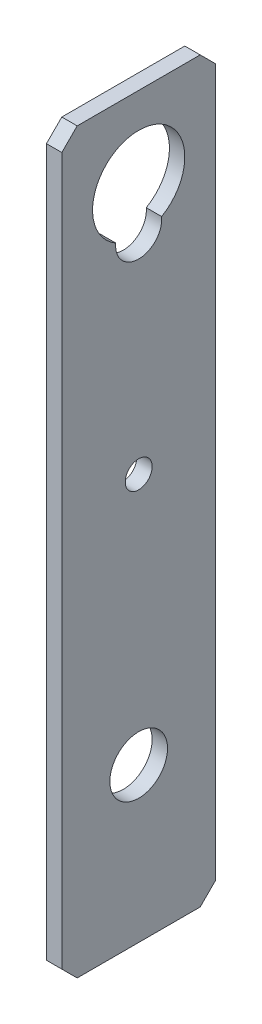
ISO-10303-21;
HEADER;
FILE_DESCRIPTION(('STEP AP214'),'2;1');
FILE_NAME('part.step','',(''),(''),'','','');
FILE_SCHEMA(('AUTOMOTIVE_DESIGN { 1 0 10303 214 1 1 1 1 }'));
ENDSEC;
DATA;
#1=APPLICATION_CONTEXT('core data for automotive mechanical design processes');
#2=APPLICATION_PROTOCOL_DEFINITION('international standard','automotive_design',2000,#1);
#3=PRODUCT_CONTEXT('',#1,'mechanical');
#4=PRODUCT('Part','Part','',(#3));
#5=PRODUCT_RELATED_PRODUCT_CATEGORY('part','',(#4));
#6=PRODUCT_DEFINITION_FORMATION('','',#4);
#7=PRODUCT_DEFINITION_CONTEXT('part definition',#1,'design');
#8=PRODUCT_DEFINITION('design','',#6,#7);
#9=PRODUCT_DEFINITION_SHAPE('','',#8);
#10=(LENGTH_UNIT() NAMED_UNIT(*) SI_UNIT(.MILLI.,.METRE.));
#11=(NAMED_UNIT(*) PLANE_ANGLE_UNIT() SI_UNIT($,.RADIAN.));
#12=(NAMED_UNIT(*) SI_UNIT($,.STERADIAN.) SOLID_ANGLE_UNIT());
#13=UNCERTAINTY_MEASURE_WITH_UNIT(LENGTH_MEASURE(1.E-05),#10,'distance_accuracy_value','');
#14=(GEOMETRIC_REPRESENTATION_CONTEXT(3) GLOBAL_UNCERTAINTY_ASSIGNED_CONTEXT((#13)) GLOBAL_UNIT_ASSIGNED_CONTEXT((#10,
#11,#12)) REPRESENTATION_CONTEXT('',''));
#15=CARTESIAN_POINT('',(0.,0.,0.));
#16=DIRECTION('',(0.,0.,1.));
#17=DIRECTION('',(1.,0.,0.));
#18=AXIS2_PLACEMENT_3D('',#15,#16,#17);
#19=CARTESIAN_POINT('',(2.,-48.,-10.));
#20=DIRECTION('',(0.,0.,1.));
#21=DIRECTION('',(1.,0.,0.));
#22=AXIS2_PLACEMENT_3D('',#19,#20,#21);
#23=PLANE('',#22);
#24=DIRECTION('',(0.,1.,0.));
#25=VECTOR('',#24,1.);
#26=CARTESIAN_POINT('',(2.,-48.,-10.));
#27=LINE('',#26,#25);
#28=CARTESIAN_POINT('',(2.,-46.,-10.));
#29=VERTEX_POINT('',#28);
#30=CARTESIAN_POINT('',(2.,46.,-10.));
#31=VERTEX_POINT('',#30);
#32=EDGE_CURVE('E155',#29,#31,#27,.T.);
#33=ORIENTED_EDGE('',*,*,#32,.F.);
#34=DIRECTION('',(-1.,0.,0.));
#35=VECTOR('',#34,1.);
#36=CARTESIAN_POINT('',(2.,-46.,-10.));
#37=LINE('',#36,#35);
#38=CARTESIAN_POINT('',(0.,-46.,-10.));
#39=VERTEX_POINT('',#38);
#40=EDGE_CURVE('E202',#29,#39,#37,.T.);
#41=ORIENTED_EDGE('',*,*,#40,.T.);
#42=DIRECTION('',(0.,1.,0.));
#43=VECTOR('',#42,1.);
#44=CARTESIAN_POINT('',(0.,-48.,-10.));
#45=LINE('',#44,#43);
#46=CARTESIAN_POINT('',(0.,46.,-10.));
#47=VERTEX_POINT('',#46);
#48=EDGE_CURVE('E151',#39,#47,#45,.T.);
#49=ORIENTED_EDGE('',*,*,#48,.T.);
#50=DIRECTION('',(1.,0.,0.));
#51=VECTOR('',#50,1.);
#52=CARTESIAN_POINT('',(2.,46.,-10.));
#53=LINE('',#52,#51);
#54=EDGE_CURVE('E200',#47,#31,#53,.T.);
#55=ORIENTED_EDGE('',*,*,#54,.T.);
#56=EDGE_LOOP('',(#33,#41,#49,#55));
#57=FACE_BOUND('',#56,.T.);
#58=ADVANCED_FACE('F41',(#57),#23,.F.);
#59=CARTESIAN_POINT('',(2.,48.,10.));
#60=DIRECTION('',(0.,-1.,0.));
#61=DIRECTION('',(0.,0.,-1.));
#62=AXIS2_PLACEMENT_3D('',#59,#60,#61);
#63=PLANE('',#62);
#64=DIRECTION('',(0.,0.,1.));
#65=VECTOR('',#64,1.);
#66=CARTESIAN_POINT('',(2.,48.,10.));
#67=LINE('',#66,#65);
#68=CARTESIAN_POINT('',(2.,48.,-8.));
#69=VERTEX_POINT('',#68);
#70=CARTESIAN_POINT('',(2.,48.,7.99999999999999));
#71=VERTEX_POINT('',#70);
#72=EDGE_CURVE('E157',#69,#71,#67,.T.);
#73=ORIENTED_EDGE('',*,*,#72,.F.);
#74=DIRECTION('',(-1.,0.,0.));
#75=VECTOR('',#74,1.);
#76=CARTESIAN_POINT('',(2.,48.,-8.));
#77=LINE('',#76,#75);
#78=CARTESIAN_POINT('',(0.,48.,-8.));
#79=VERTEX_POINT('',#78);
#80=EDGE_CURVE('E11',#69,#79,#77,.T.);
#81=ORIENTED_EDGE('',*,*,#80,.T.);
#82=DIRECTION('',(0.,0.,1.));
#83=VECTOR('',#82,1.);
#84=CARTESIAN_POINT('',(0.,48.,10.));
#85=LINE('',#84,#83);
#86=CARTESIAN_POINT('',(0.,48.,7.99999999999999));
#87=VERTEX_POINT('',#86);
#88=EDGE_CURVE('E169',#79,#87,#85,.T.);
#89=ORIENTED_EDGE('',*,*,#88,.T.);
#90=DIRECTION('',(1.,0.,0.));
#91=VECTOR('',#90,1.);
#92=CARTESIAN_POINT('',(2.,48.,7.99999999999999));
#93=LINE('',#92,#91);
#94=EDGE_CURVE('E50',#87,#71,#93,.T.);
#95=ORIENTED_EDGE('',*,*,#94,.T.);
#96=EDGE_LOOP('',(#73,#81,#89,#95));
#97=FACE_BOUND('',#96,.T.);
#98=ADVANCED_FACE('F218',(#97),#63,.F.);
#99=CARTESIAN_POINT('',(2.,-48.,10.));
#100=DIRECTION('',(0.,0.,-1.));
#101=DIRECTION('',(-1.,0.,0.));
#102=AXIS2_PLACEMENT_3D('',#99,#100,#101);
#103=PLANE('',#102);
#104=DIRECTION('',(0.,-1.,0.));
#105=VECTOR('',#104,1.);
#106=CARTESIAN_POINT('',(0.,-48.,10.));
#107=LINE('',#106,#105);
#108=CARTESIAN_POINT('',(0.,46.,10.));
#109=VERTEX_POINT('',#108);
#110=CARTESIAN_POINT('',(0.,-46.,10.));
#111=VERTEX_POINT('',#110);
#112=EDGE_CURVE('E171',#109,#111,#107,.T.);
#113=ORIENTED_EDGE('',*,*,#112,.T.);
#114=DIRECTION('',(1.,0.,0.));
#115=VECTOR('',#114,1.);
#116=CARTESIAN_POINT('',(2.,-46.,10.));
#117=LINE('',#116,#115);
#118=CARTESIAN_POINT('',(2.,-46.,10.));
#119=VERTEX_POINT('',#118);
#120=EDGE_CURVE('E191',#111,#119,#117,.T.);
#121=ORIENTED_EDGE('',*,*,#120,.T.);
#122=DIRECTION('',(0.,-1.,0.));
#123=VECTOR('',#122,1.);
#124=CARTESIAN_POINT('',(2.,-48.,10.));
#125=LINE('',#124,#123);
#126=CARTESIAN_POINT('',(2.,46.,10.));
#127=VERTEX_POINT('',#126);
#128=EDGE_CURVE('E160',#127,#119,#125,.T.);
#129=ORIENTED_EDGE('',*,*,#128,.F.);
#130=DIRECTION('',(-1.,0.,0.));
#131=VECTOR('',#130,1.);
#132=CARTESIAN_POINT('',(2.,46.,10.));
#133=LINE('',#132,#131);
#134=EDGE_CURVE('E188',#127,#109,#133,.T.);
#135=ORIENTED_EDGE('',*,*,#134,.T.);
#136=EDGE_LOOP('',(#113,#121,#129,#135));
#137=FACE_BOUND('',#136,.T.);
#138=ADVANCED_FACE('F225',(#137),#103,.F.);
#139=CARTESIAN_POINT('',(2.,-48.,10.));
#140=DIRECTION('',(0.,1.,0.));
#141=DIRECTION('',(0.,0.,1.));
#142=AXIS2_PLACEMENT_3D('',#139,#140,#141);
#143=PLANE('',#142);
#144=DIRECTION('',(0.,0.,-1.));
#145=VECTOR('',#144,1.);
#146=CARTESIAN_POINT('',(2.,-48.,10.));
#147=LINE('',#146,#145);
#148=CARTESIAN_POINT('',(2.,-48.,8.));
#149=VERTEX_POINT('',#148);
#150=CARTESIAN_POINT('',(2.,-48.,-7.99999999999998));
#151=VERTEX_POINT('',#150);
#152=EDGE_CURVE('E163',#149,#151,#147,.T.);
#153=ORIENTED_EDGE('',*,*,#152,.F.);
#154=DIRECTION('',(-1.,0.,0.));
#155=VECTOR('',#154,1.);
#156=CARTESIAN_POINT('',(2.,-48.,8.));
#157=LINE('',#156,#155);
#158=CARTESIAN_POINT('',(0.,-48.,8.));
#159=VERTEX_POINT('',#158);
#160=EDGE_CURVE('E177',#149,#159,#157,.T.);
#161=ORIENTED_EDGE('',*,*,#160,.T.);
#162=DIRECTION('',(0.,0.,-1.));
#163=VECTOR('',#162,1.);
#164=CARTESIAN_POINT('',(0.,-48.,10.));
#165=LINE('',#164,#163);
#166=CARTESIAN_POINT('',(0.,-48.,-7.99999999999998));
#167=VERTEX_POINT('',#166);
#168=EDGE_CURVE('E158',#159,#167,#165,.T.);
#169=ORIENTED_EDGE('',*,*,#168,.T.);
#170=DIRECTION('',(1.,0.,0.));
#171=VECTOR('',#170,1.);
#172=CARTESIAN_POINT('',(2.,-48.,-7.99999999999998));
#173=LINE('',#172,#171);
#174=EDGE_CURVE('E166',#167,#151,#173,.T.);
#175=ORIENTED_EDGE('',*,*,#174,.T.);
#176=EDGE_LOOP('',(#153,#161,#169,#175));
#177=FACE_BOUND('',#176,.T.);
#178=ADVANCED_FACE('F233',(#177),#143,.F.);
#179=CARTESIAN_POINT('',(2.,0.,0.));
#180=DIRECTION('',(-1.,0.,0.));
#181=DIRECTION('',(0.,0.,1.));
#182=AXIS2_PLACEMENT_3D('',#179,#180,#181);
#183=PLANE('',#182);
#184=CARTESIAN_POINT('',(2.,37.5,0.));
#185=DIRECTION('',(1.,0.,0.));
#186=DIRECTION('',(0.,0.,-1.));
#187=AXIS2_PLACEMENT_3D('',#184,#185,#186);
#188=CIRCLE('',#187,6.);
#189=CARTESIAN_POINT('',(2.,32.2954545454545,-2.98541565139099));
#190=VERTEX_POINT('',#189);
#191=CARTESIAN_POINT('',(2.,32.2954545454545,2.98541565139099));
#192=VERTEX_POINT('',#191);
#193=EDGE_CURVE('E133',#190,#192,#188,.T.);
#194=ORIENTED_EDGE('',*,*,#193,.F.);
#195=CARTESIAN_POINT('',(2.,32.,0.));
#196=DIRECTION('',(1.,0.,0.));
#197=DIRECTION('',(0.,0.,-1.));
#198=AXIS2_PLACEMENT_3D('',#195,#196,#197);
#199=CIRCLE('',#198,3.);
#200=EDGE_CURVE('E123',#192,#190,#199,.T.);
#201=ORIENTED_EDGE('',*,*,#200,.F.);
#202=EDGE_LOOP('',(#194,#201));
#203=FACE_BOUND('',#202,.T.);
#204=CARTESIAN_POINT('',(2.,-28.,0.));
#205=DIRECTION('',(1.,0.,0.));
#206=DIRECTION('',(0.,0.,-1.));
#207=AXIS2_PLACEMENT_3D('',#204,#205,#206);
#208=CIRCLE('',#207,3.75);
#209=CARTESIAN_POINT('',(2.,-28.,-3.75));
#210=VERTEX_POINT('',#209);
#211=EDGE_CURVE('E142',#210,#210,#208,.T.);
#212=ORIENTED_EDGE('',*,*,#211,.F.);
#213=EDGE_LOOP('',(#212));
#214=FACE_BOUND('',#213,.T.);
#215=CARTESIAN_POINT('',(2.,4.74999999999999,0.));
#216=DIRECTION('',(1.,0.,0.));
#217=DIRECTION('',(0.,0.,-1.));
#218=AXIS2_PLACEMENT_3D('',#215,#216,#217);
#219=CIRCLE('',#218,1.75);
#220=CARTESIAN_POINT('',(2.,4.74999999999999,-1.75));
#221=VERTEX_POINT('',#220);
#222=EDGE_CURVE('E152',#221,#221,#219,.T.);
#223=ORIENTED_EDGE('',*,*,#222,.F.);
#224=EDGE_LOOP('',(#223));
#225=FACE_BOUND('',#224,.T.);
#226=ORIENTED_EDGE('',*,*,#128,.T.);
#227=DIRECTION('',(0.,0.70710678118655,0.707106781186545));
#228=VECTOR('',#227,1.);
#229=CARTESIAN_POINT('',(2.,-48.,8.));
#230=LINE('',#229,#228);
#231=EDGE_CURVE('E198',#119,#149,#230,.F.);
#232=ORIENTED_EDGE('',*,*,#231,.T.);
#233=ORIENTED_EDGE('',*,*,#152,.T.);
#234=DIRECTION('',(0.,-0.707106781186545,0.70710678118655));
#235=VECTOR('',#234,1.);
#236=CARTESIAN_POINT('',(2.,-46.,-10.));
#237=LINE('',#236,#235);
#238=EDGE_CURVE('E196',#151,#29,#237,.F.);
#239=ORIENTED_EDGE('',*,*,#238,.T.);
#240=ORIENTED_EDGE('',*,*,#32,.T.);
#241=DIRECTION('',(0.,-0.70710678118655,-0.707106781186545));
#242=VECTOR('',#241,1.);
#243=CARTESIAN_POINT('',(2.,48.,-8.));
#244=LINE('',#243,#242);
#245=EDGE_CURVE('E63',#31,#69,#244,.F.);
#246=ORIENTED_EDGE('',*,*,#245,.T.);
#247=ORIENTED_EDGE('',*,*,#72,.T.);
#248=DIRECTION('',(0.,0.707106781186545,-0.70710678118655));
#249=VECTOR('',#248,1.);
#250=CARTESIAN_POINT('',(2.,46.,10.));
#251=LINE('',#250,#249);
#252=EDGE_CURVE('E193',#71,#127,#251,.F.);
#253=ORIENTED_EDGE('',*,*,#252,.T.);
#254=EDGE_LOOP('',(#226,#232,#233,#239,#240,#246,#247,#253));
#255=FACE_BOUND('',#254,.T.);
#256=ADVANCED_FACE('F137',(#203,#214,#225,#255),#183,.F.);
#257=CARTESIAN_POINT('',(0.,0.,0.));
#258=DIRECTION('',(-1.,0.,0.));
#259=DIRECTION('',(0.,0.,1.));
#260=AXIS2_PLACEMENT_3D('',#257,#258,#259);
#261=PLANE('',#260);
#262=CARTESIAN_POINT('',(0.,32.,0.));
#263=DIRECTION('',(1.,0.,0.));
#264=DIRECTION('',(0.,0.,-1.));
#265=AXIS2_PLACEMENT_3D('',#262,#263,#264);
#266=CIRCLE('',#265,3.);
#267=CARTESIAN_POINT('',(0.,32.2954545454545,2.98541565139099));
#268=VERTEX_POINT('',#267);
#269=CARTESIAN_POINT('',(0.,32.2954545454545,-2.98541565139098));
#270=VERTEX_POINT('',#269);
#271=EDGE_CURVE('E126',#268,#270,#266,.T.);
#272=ORIENTED_EDGE('',*,*,#271,.T.);
#273=CARTESIAN_POINT('',(0.,37.5,0.));
#274=DIRECTION('',(1.,0.,0.));
#275=DIRECTION('',(0.,0.,-1.));
#276=AXIS2_PLACEMENT_3D('',#273,#274,#275);
#277=CIRCLE('',#276,6.);
#278=EDGE_CURVE('E145',#270,#268,#277,.T.);
#279=ORIENTED_EDGE('',*,*,#278,.T.);
#280=EDGE_LOOP('',(#272,#279));
#281=FACE_BOUND('',#280,.T.);
#282=CARTESIAN_POINT('',(0.,-28.,0.));
#283=DIRECTION('',(1.,0.,0.));
#284=DIRECTION('',(0.,0.,-1.));
#285=AXIS2_PLACEMENT_3D('',#282,#283,#284);
#286=CIRCLE('',#285,3.75);
#287=CARTESIAN_POINT('',(0.,-28.,-3.75));
#288=VERTEX_POINT('',#287);
#289=EDGE_CURVE('E139',#288,#288,#286,.T.);
#290=ORIENTED_EDGE('',*,*,#289,.T.);
#291=EDGE_LOOP('',(#290));
#292=FACE_BOUND('',#291,.T.);
#293=CARTESIAN_POINT('',(0.,4.74999999999999,0.));
#294=DIRECTION('',(1.,0.,0.));
#295=DIRECTION('',(0.,0.,-1.));
#296=AXIS2_PLACEMENT_3D('',#293,#294,#295);
#297=CIRCLE('',#296,1.75);
#298=CARTESIAN_POINT('',(0.,4.74999999999999,-1.75));
#299=VERTEX_POINT('',#298);
#300=EDGE_CURVE('E148',#299,#299,#297,.T.);
#301=ORIENTED_EDGE('',*,*,#300,.T.);
#302=EDGE_LOOP('',(#301));
#303=FACE_BOUND('',#302,.T.);
#304=ORIENTED_EDGE('',*,*,#168,.F.);
#305=DIRECTION('',(0.,-0.70710678118655,-0.707106781186545));
#306=VECTOR('',#305,1.);
#307=CARTESIAN_POINT('',(0.,-27.9999999999998,28.));
#308=LINE('',#307,#306);
#309=EDGE_CURVE('E186',#159,#111,#308,.F.);
#310=ORIENTED_EDGE('',*,*,#309,.T.);
#311=ORIENTED_EDGE('',*,*,#112,.F.);
#312=DIRECTION('',(0.,-0.707106781186545,0.70710678118655));
#313=VECTOR('',#312,1.);
#314=CARTESIAN_POINT('',(0.,28.0000000000002,28.));
#315=LINE('',#314,#313);
#316=EDGE_CURVE('E180',#109,#87,#315,.F.);
#317=ORIENTED_EDGE('',*,*,#316,.T.);
#318=ORIENTED_EDGE('',*,*,#88,.F.);
#319=DIRECTION('',(0.,0.70710678118655,0.707106781186545));
#320=VECTOR('',#319,1.);
#321=CARTESIAN_POINT('',(0.,27.9999999999998,-28.));
#322=LINE('',#321,#320);
#323=EDGE_CURVE('E182',#79,#47,#322,.F.);
#324=ORIENTED_EDGE('',*,*,#323,.T.);
#325=ORIENTED_EDGE('',*,*,#48,.F.);
#326=DIRECTION('',(0.,0.707106781186545,-0.70710678118655));
#327=VECTOR('',#326,1.);
#328=CARTESIAN_POINT('',(0.,-28.0000000000002,-28.));
#329=LINE('',#328,#327);
#330=EDGE_CURVE('E184',#39,#167,#329,.F.);
#331=ORIENTED_EDGE('',*,*,#330,.T.);
#332=EDGE_LOOP('',(#304,#310,#311,#317,#318,#324,#325,#331));
#333=FACE_BOUND('',#332,.T.);
#334=ADVANCED_FACE('F213',(#281,#292,#303,#333),#261,.T.);
#335=CARTESIAN_POINT('',(0.,4.74999999999999,0.));
#336=DIRECTION('',(1.,0.,0.));
#337=DIRECTION('',(0.,0.,-1.));
#338=AXIS2_PLACEMENT_3D('',#335,#336,#337);
#339=CYLINDRICAL_SURFACE('',#338,1.75);
#340=ORIENTED_EDGE('',*,*,#300,.F.);
#341=EDGE_LOOP('',(#340));
#342=FACE_BOUND('',#341,.T.);
#343=ORIENTED_EDGE('',*,*,#222,.T.);
#344=EDGE_LOOP('',(#343));
#345=FACE_BOUND('',#344,.T.);
#346=ADVANCED_FACE('F268',(#342,#345),#339,.F.);
#347=CARTESIAN_POINT('',(0.,-28.,0.));
#348=DIRECTION('',(1.,0.,0.));
#349=DIRECTION('',(0.,0.,-1.));
#350=AXIS2_PLACEMENT_3D('',#347,#348,#349);
#351=CYLINDRICAL_SURFACE('',#350,3.75);
#352=ORIENTED_EDGE('',*,*,#289,.F.);
#353=EDGE_LOOP('',(#352));
#354=FACE_BOUND('',#353,.T.);
#355=ORIENTED_EDGE('',*,*,#211,.T.);
#356=EDGE_LOOP('',(#355));
#357=FACE_BOUND('',#356,.T.);
#358=ADVANCED_FACE('F274',(#354,#357),#351,.F.);
#359=CARTESIAN_POINT('',(0.,32.,0.));
#360=DIRECTION('',(1.,0.,0.));
#361=DIRECTION('',(0.,0.,-1.));
#362=AXIS2_PLACEMENT_3D('',#359,#360,#361);
#363=CYLINDRICAL_SURFACE('',#362,3.);
#364=ORIENTED_EDGE('',*,*,#200,.T.);
#365=DIRECTION('',(1.,0.,0.));
#366=VECTOR('',#365,1.);
#367=CARTESIAN_POINT('',(0.,32.2954545454545,-2.98541565139098));
#368=LINE('',#367,#366);
#369=EDGE_CURVE('E130',#270,#190,#368,.T.);
#370=ORIENTED_EDGE('',*,*,#369,.F.);
#371=ORIENTED_EDGE('',*,*,#271,.F.);
#372=DIRECTION('',(1.,0.,0.));
#373=VECTOR('',#372,1.);
#374=CARTESIAN_POINT('',(0.,32.2954545454545,2.98541565139099));
#375=LINE('',#374,#373);
#376=EDGE_CURVE('E119',#268,#192,#375,.T.);
#377=ORIENTED_EDGE('',*,*,#376,.T.);
#378=EDGE_LOOP('',(#364,#370,#371,#377));
#379=FACE_BOUND('',#378,.T.);
#380=ADVANCED_FACE('F121',(#379),#363,.F.);
#381=CARTESIAN_POINT('',(0.,37.5,0.));
#382=DIRECTION('',(1.,0.,0.));
#383=DIRECTION('',(0.,0.,-1.));
#384=AXIS2_PLACEMENT_3D('',#381,#382,#383);
#385=CYLINDRICAL_SURFACE('',#384,6.);
#386=ORIENTED_EDGE('',*,*,#193,.T.);
#387=ORIENTED_EDGE('',*,*,#376,.F.);
#388=ORIENTED_EDGE('',*,*,#278,.F.);
#389=ORIENTED_EDGE('',*,*,#369,.T.);
#390=EDGE_LOOP('',(#386,#387,#388,#389));
#391=FACE_BOUND('',#390,.T.);
#392=ADVANCED_FACE('F134',(#391),#385,.F.);
#393=CARTESIAN_POINT('',(2.,-48.,8.));
#394=DIRECTION('',(0.,0.707106781186545,-0.70710678118655));
#395=DIRECTION('',(-1.,0.,0.));
#396=AXIS2_PLACEMENT_3D('',#393,#394,#395);
#397=PLANE('',#396);
#398=ORIENTED_EDGE('',*,*,#231,.F.);
#399=ORIENTED_EDGE('',*,*,#120,.F.);
#400=ORIENTED_EDGE('',*,*,#309,.F.);
#401=ORIENTED_EDGE('',*,*,#160,.F.);
#402=EDGE_LOOP('',(#398,#399,#400,#401));
#403=FACE_BOUND('',#402,.T.);
#404=ADVANCED_FACE('F230',(#403),#397,.F.);
#405=CARTESIAN_POINT('',(2.,-46.,-10.));
#406=DIRECTION('',(0.,0.70710678118655,0.707106781186545));
#407=DIRECTION('',(-1.,0.,0.));
#408=AXIS2_PLACEMENT_3D('',#405,#406,#407);
#409=PLANE('',#408);
#410=ORIENTED_EDGE('',*,*,#238,.F.);
#411=ORIENTED_EDGE('',*,*,#174,.F.);
#412=ORIENTED_EDGE('',*,*,#330,.F.);
#413=ORIENTED_EDGE('',*,*,#40,.F.);
#414=EDGE_LOOP('',(#410,#411,#412,#413));
#415=FACE_BOUND('',#414,.T.);
#416=ADVANCED_FACE('F235',(#415),#409,.F.);
#417=CARTESIAN_POINT('',(2.,48.,-8.));
#418=DIRECTION('',(0.,-0.707106781186545,0.70710678118655));
#419=DIRECTION('',(-1.,0.,0.));
#420=AXIS2_PLACEMENT_3D('',#417,#418,#419);
#421=PLANE('',#420);
#422=ORIENTED_EDGE('',*,*,#245,.F.);
#423=ORIENTED_EDGE('',*,*,#54,.F.);
#424=ORIENTED_EDGE('',*,*,#323,.F.);
#425=ORIENTED_EDGE('',*,*,#80,.F.);
#426=EDGE_LOOP('',(#422,#423,#424,#425));
#427=FACE_BOUND('',#426,.T.);
#428=ADVANCED_FACE('F217',(#427),#421,.F.);
#429=CARTESIAN_POINT('',(2.,46.,10.));
#430=DIRECTION('',(0.,-0.70710678118655,-0.707106781186545));
#431=DIRECTION('',(-1.,0.,0.));
#432=AXIS2_PLACEMENT_3D('',#429,#430,#431);
#433=PLANE('',#432);
#434=ORIENTED_EDGE('',*,*,#252,.F.);
#435=ORIENTED_EDGE('',*,*,#94,.F.);
#436=ORIENTED_EDGE('',*,*,#316,.F.);
#437=ORIENTED_EDGE('',*,*,#134,.F.);
#438=EDGE_LOOP('',(#434,#435,#436,#437));
#439=FACE_BOUND('',#438,.T.);
#440=ADVANCED_FACE('F44',(#439),#433,.F.);
#441=CLOSED_SHELL('',(#58,#98,#138,#178,#256,#334,#346,#358,#380,#392,#404,#416,#428,#440));
#442=MANIFOLD_SOLID_BREP('B2',#441);
#443=ADVANCED_BREP_SHAPE_REPRESENTATION('',(#18,#442),#14);
#444=SHAPE_DEFINITION_REPRESENTATION(#9,#443);
ENDSEC;
END-ISO-10303-21;
